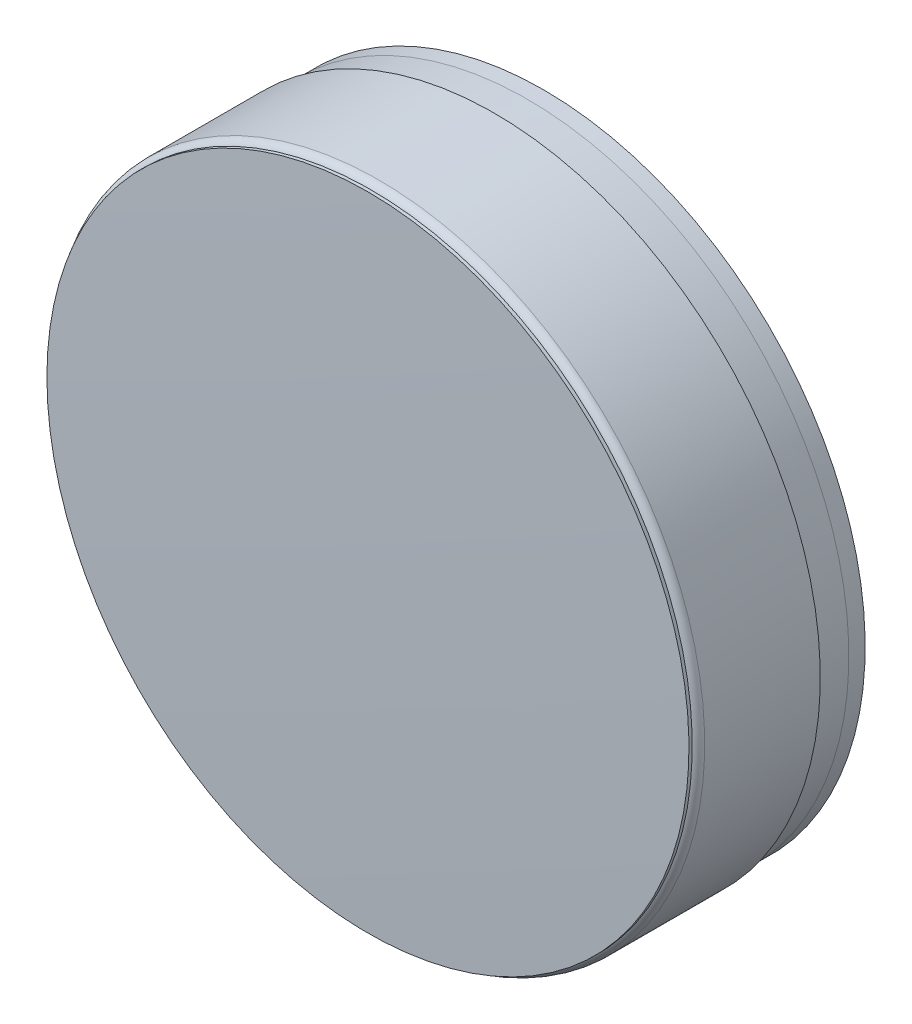
ISO-10303-21;
HEADER;
FILE_DESCRIPTION(('STEP AP214'),'2;1');
FILE_NAME('part.step','',(''),(''),'','','');
FILE_SCHEMA(('AUTOMOTIVE_DESIGN { 1 0 10303 214 1 1 1 1 }'));
ENDSEC;
DATA;
#1=APPLICATION_CONTEXT('core data for automotive mechanical design processes');
#2=APPLICATION_PROTOCOL_DEFINITION('international standard','automotive_design',2000,#1);
#3=PRODUCT_CONTEXT('',#1,'mechanical');
#4=PRODUCT('Part','Part','',(#3));
#5=PRODUCT_RELATED_PRODUCT_CATEGORY('part','',(#4));
#6=PRODUCT_DEFINITION_FORMATION('','',#4);
#7=PRODUCT_DEFINITION_CONTEXT('part definition',#1,'design');
#8=PRODUCT_DEFINITION('design','',#6,#7);
#9=PRODUCT_DEFINITION_SHAPE('','',#8);
#10=(LENGTH_UNIT() NAMED_UNIT(*) SI_UNIT(.MILLI.,.METRE.));
#11=(NAMED_UNIT(*) PLANE_ANGLE_UNIT() SI_UNIT($,.RADIAN.));
#12=(NAMED_UNIT(*) SI_UNIT($,.STERADIAN.) SOLID_ANGLE_UNIT());
#13=UNCERTAINTY_MEASURE_WITH_UNIT(LENGTH_MEASURE(1.E-05),#10,'distance_accuracy_value','');
#14=(GEOMETRIC_REPRESENTATION_CONTEXT(3) GLOBAL_UNCERTAINTY_ASSIGNED_CONTEXT((#13)) GLOBAL_UNIT_ASSIGNED_CONTEXT((#10,
#11,#12)) REPRESENTATION_CONTEXT('',''));
#15=CARTESIAN_POINT('',(0.,0.,0.));
#16=DIRECTION('',(0.,0.,1.));
#17=DIRECTION('',(1.,0.,0.));
#18=AXIS2_PLACEMENT_3D('',#15,#16,#17);
#19=CARTESIAN_POINT('',(0.,0.,-199.999999999999));
#20=DIRECTION('',(0.,0.,-1.));
#21=DIRECTION('',(0.,1.,0.));
#22=AXIS2_PLACEMENT_3D('',#19,#20,#21);
#23=SPHERICAL_SURFACE('',#22,199.999999999999);
#24=CARTESIAN_POINT('',(0.,0.,-0.0606482580280112));
#25=DIRECTION('',(0.,0.,-1.));
#26=DIRECTION('',(-1.,0.,0.));
#27=AXIS2_PLACEMENT_3D('',#24,#25,#26);
#28=CIRCLE('',#27,4.92499999999994);
#29=CARTESIAN_POINT('',(-4.92499999999994,0.,-0.0606482580280112));
#30=VERTEX_POINT('',#29);
#31=EDGE_CURVE('E56',#30,#30,#28,.T.);
#32=ORIENTED_EDGE('',*,*,#31,.F.);
#33=EDGE_LOOP('',(#32));
#34=FACE_BOUND('',#33,.T.);
#35=ADVANCED_FACE('F31',(#34),#23,.T.);
#36=CARTESIAN_POINT('',(0.,0.,47.));
#37=DIRECTION('',(0.,0.,-1.));
#38=DIRECTION('',(0.,1.,0.));
#39=AXIS2_PLACEMENT_3D('',#36,#37,#38);
#40=SPHERICAL_SURFACE('',#39,50.);
#41=CARTESIAN_POINT('',(0.,0.,-2.75612689498605));
#42=DIRECTION('',(0.,0.,-1.));
#43=DIRECTION('',(-1.,0.,0.));
#44=AXIS2_PLACEMENT_3D('',#41,#42,#43);
#45=CIRCLE('',#44,4.93232565936656);
#46=CARTESIAN_POINT('',(-4.93232565936656,0.,-2.75612689498605));
#47=VERTEX_POINT('',#46);
#48=EDGE_CURVE('E10',#47,#47,#45,.T.);
#49=ORIENTED_EDGE('',*,*,#48,.T.);
#50=EDGE_LOOP('',(#49));
#51=FACE_BOUND('',#50,.T.);
#52=ADVANCED_FACE('F64',(#51),#40,.T.);
#53=CARTESIAN_POINT('',(0.,0.,-7.41408075484484));
#54=DIRECTION('',(0.,0.,-1.));
#55=DIRECTION('',(-1.,0.,0.));
#56=AXIS2_PLACEMENT_3D('',#53,#54,#55);
#57=CYLINDRICAL_SURFACE('',#56,4.93232565936656);
#58=CARTESIAN_POINT('',(0.,0.,-2.50612689498605));
#59=DIRECTION('',(0.,0.,-1.));
#60=DIRECTION('',(-1.,0.,0.));
#61=AXIS2_PLACEMENT_3D('',#58,#59,#60);
#62=CIRCLE('',#61,4.93232565936656);
#63=CARTESIAN_POINT('',(-4.93232565936656,0.,-2.50612689498605));
#64=VERTEX_POINT('',#63);
#65=EDGE_CURVE('E37',#64,#64,#62,.T.);
#66=ORIENTED_EDGE('',*,*,#65,.T.);
#67=EDGE_LOOP('',(#66));
#68=FACE_BOUND('',#67,.T.);
#69=ORIENTED_EDGE('',*,*,#48,.F.);
#70=EDGE_LOOP('',(#69));
#71=FACE_BOUND('',#70,.T.);
#72=ADVANCED_FACE('F68',(#68,#71),#57,.T.);
#73=CARTESIAN_POINT('',(0.,0.,-2.50612689498605));
#74=DIRECTION('',(0.,0.,1.));
#75=DIRECTION('',(1.,0.,0.));
#76=AXIS2_PLACEMENT_3D('',#73,#74,#75);
#77=CONICAL_SURFACE('',#76,4.93232565936656,0.034906585039884);
#78=CARTESIAN_POINT('',(0.,0.,-2.));
#79=DIRECTION('',(0.,0.,-1.));
#80=DIRECTION('',(-1.,0.,0.));
#81=AXIS2_PLACEMENT_3D('',#78,#79,#80);
#82=CIRCLE('',#81,4.94999999999994);
#83=CARTESIAN_POINT('',(-4.94999999999994,0.,-2.));
#84=VERTEX_POINT('',#83);
#85=EDGE_CURVE('E41',#84,#84,#82,.T.);
#86=ORIENTED_EDGE('',*,*,#85,.T.);
#87=EDGE_LOOP('',(#86));
#88=FACE_BOUND('',#87,.T.);
#89=ORIENTED_EDGE('',*,*,#65,.F.);
#90=EDGE_LOOP('',(#89));
#91=FACE_BOUND('',#90,.T.);
#92=ADVANCED_FACE('F72',(#88,#91),#77,.T.);
#93=CARTESIAN_POINT('',(0.,5.,-2.));
#94=DIRECTION('',(0.,0.,-1.));
#95=DIRECTION('',(-1.,0.,0.));
#96=AXIS2_PLACEMENT_3D('',#93,#94,#95);
#97=PLANE('',#96);
#98=CARTESIAN_POINT('',(0.,0.,-2.));
#99=DIRECTION('',(0.,0.,-1.));
#100=DIRECTION('',(-1.,0.,0.));
#101=AXIS2_PLACEMENT_3D('',#98,#99,#100);
#102=CIRCLE('',#101,4.99999999999994);
#103=CARTESIAN_POINT('',(-4.99999999999994,0.,-2.));
#104=VERTEX_POINT('',#103);
#105=EDGE_CURVE('E45',#104,#104,#102,.T.);
#106=ORIENTED_EDGE('',*,*,#105,.T.);
#107=EDGE_LOOP('',(#106));
#108=FACE_BOUND('',#107,.T.);
#109=ORIENTED_EDGE('',*,*,#85,.F.);
#110=EDGE_LOOP('',(#109));
#111=FACE_BOUND('',#110,.T.);
#112=ADVANCED_FACE('F77',(#108,#111),#97,.T.);
#113=CARTESIAN_POINT('',(0.,0.,-7.41408075484484));
#114=DIRECTION('',(0.,0.,-1.));
#115=DIRECTION('',(-1.,0.,0.));
#116=AXIS2_PLACEMENT_3D('',#113,#114,#115);
#117=CYLINDRICAL_SURFACE('',#116,4.99999999999994);
#118=CARTESIAN_POINT('',(0.,0.,-0.226514560290577));
#119=DIRECTION('',(0.,0.,-1.));
#120=DIRECTION('',(-1.,0.,0.));
#121=AXIS2_PLACEMENT_3D('',#118,#119,#120);
#122=CIRCLE('',#121,4.99999999999994);
#123=CARTESIAN_POINT('',(-4.99999999999994,0.,-0.226514560290577));
#124=VERTEX_POINT('',#123);
#125=EDGE_CURVE('E50',#124,#124,#122,.T.);
#126=ORIENTED_EDGE('',*,*,#125,.T.);
#127=EDGE_LOOP('',(#126));
#128=FACE_BOUND('',#127,.T.);
#129=ORIENTED_EDGE('',*,*,#105,.F.);
#130=EDGE_LOOP('',(#129));
#131=FACE_BOUND('',#130,.T.);
#132=ADVANCED_FACE('F81',(#128,#131),#117,.T.);
#133=CARTESIAN_POINT('',(0.,0.,-0.226514560290576));
#134=DIRECTION('',(0.,0.,-1.));
#135=DIRECTION('',(-1.,0.,0.));
#136=AXIS2_PLACEMENT_3D('',#133,#134,#135);
#137=TOROIDAL_SURFACE('',#136,4.87299999999994,0.127);
#138=CARTESIAN_POINT('',(0.,0.,-0.110648258028011));
#139=DIRECTION('',(0.,0.,-1.));
#140=DIRECTION('',(-1.,0.,0.));
#141=AXIS2_PLACEMENT_3D('',#138,#139,#140);
#142=CIRCLE('',#141,4.92499999999994);
#143=CARTESIAN_POINT('',(-4.92499999999994,0.,-0.110648258028011));
#144=VERTEX_POINT('',#143);
#145=EDGE_CURVE('E53',#144,#144,#142,.T.);
#146=ORIENTED_EDGE('',*,*,#145,.T.);
#147=EDGE_LOOP('',(#146));
#148=FACE_BOUND('',#147,.T.);
#149=ORIENTED_EDGE('',*,*,#125,.F.);
#150=EDGE_LOOP('',(#149));
#151=FACE_BOUND('',#150,.T.);
#152=ADVANCED_FACE('F85',(#148,#151),#137,.T.);
#153=CARTESIAN_POINT('',(0.,0.,-7.41408075484484));
#154=DIRECTION('',(0.,0.,-1.));
#155=DIRECTION('',(-1.,0.,0.));
#156=AXIS2_PLACEMENT_3D('',#153,#154,#155);
#157=CYLINDRICAL_SURFACE('',#156,4.92499999999994);
#158=ORIENTED_EDGE('',*,*,#31,.T.);
#159=EDGE_LOOP('',(#158));
#160=FACE_BOUND('',#159,.T.);
#161=ORIENTED_EDGE('',*,*,#145,.F.);
#162=EDGE_LOOP('',(#161));
#163=FACE_BOUND('',#162,.T.);
#164=ADVANCED_FACE('F60',(#160,#163),#157,.T.);
#165=CLOSED_SHELL('',(#35,#52,#72,#92,#112,#132,#152,#164));
#166=MANIFOLD_SOLID_BREP('B2',#165);
#167=ADVANCED_BREP_SHAPE_REPRESENTATION('',(#18,#166),#14);
#168=SHAPE_DEFINITION_REPRESENTATION(#9,#167);
ENDSEC;
END-ISO-10303-21;
